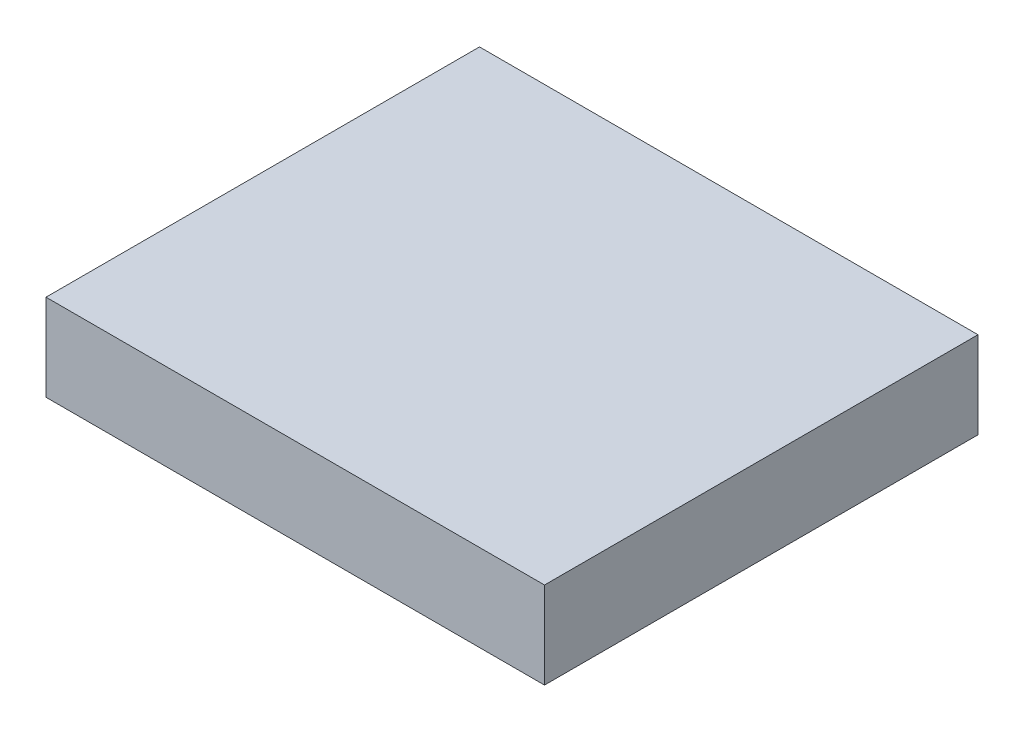
ISO-10303-21;
HEADER;
FILE_DESCRIPTION(('STEP AP214'),'2;1');
FILE_NAME('part.step','',(''),(''),'','','');
FILE_SCHEMA(('AUTOMOTIVE_DESIGN { 1 0 10303 214 1 1 1 1 }'));
ENDSEC;
DATA;
#1=APPLICATION_CONTEXT('core data for automotive mechanical design processes');
#2=APPLICATION_PROTOCOL_DEFINITION('international standard','automotive_design',2000,#1);
#3=PRODUCT_CONTEXT('',#1,'mechanical');
#4=PRODUCT('Part','Part','',(#3));
#5=PRODUCT_RELATED_PRODUCT_CATEGORY('part','',(#4));
#6=PRODUCT_DEFINITION_FORMATION('','',#4);
#7=PRODUCT_DEFINITION_CONTEXT('part definition',#1,'design');
#8=PRODUCT_DEFINITION('design','',#6,#7);
#9=PRODUCT_DEFINITION_SHAPE('','',#8);
#10=(LENGTH_UNIT() NAMED_UNIT(*) SI_UNIT(.MILLI.,.METRE.));
#11=(NAMED_UNIT(*) PLANE_ANGLE_UNIT() SI_UNIT($,.RADIAN.));
#12=(NAMED_UNIT(*) SI_UNIT($,.STERADIAN.) SOLID_ANGLE_UNIT());
#13=UNCERTAINTY_MEASURE_WITH_UNIT(LENGTH_MEASURE(1.E-05),#10,'distance_accuracy_value','');
#14=(GEOMETRIC_REPRESENTATION_CONTEXT(3) GLOBAL_UNCERTAINTY_ASSIGNED_CONTEXT((#13)) GLOBAL_UNIT_ASSIGNED_CONTEXT((#10,
#11,#12)) REPRESENTATION_CONTEXT('',''));
#15=CARTESIAN_POINT('',(0.,0.,0.));
#16=DIRECTION('',(0.,0.,1.));
#17=DIRECTION('',(1.,0.,0.));
#18=AXIS2_PLACEMENT_3D('',#15,#16,#17);
#19=CARTESIAN_POINT('',(-62.6311425092518,20.,-62.9617862825999));
#20=DIRECTION('',(1.,0.,0.));
#21=DIRECTION('',(0.,0.,-1.));
#22=AXIS2_PLACEMENT_3D('',#19,#20,#21);
#23=PLANE('',#22);
#24=DIRECTION('',(0.,0.,1.));
#25=VECTOR('',#24,1.);
#26=CARTESIAN_POINT('',(-62.6311425092518,0.,-62.9617862825999));
#27=LINE('',#26,#25);
#28=CARTESIAN_POINT('',(-62.6311425092518,0.,-62.9617862825999));
#29=VERTEX_POINT('',#28);
#30=CARTESIAN_POINT('',(-62.6311425092518,0.,37.0382137174002));
#31=VERTEX_POINT('',#30);
#32=EDGE_CURVE('E100',#29,#31,#27,.T.);
#33=ORIENTED_EDGE('',*,*,#32,.T.);
#34=DIRECTION('',(0.,-1.,0.));
#35=VECTOR('',#34,1.);
#36=CARTESIAN_POINT('',(-62.6311425092518,20.,37.0382137174002));
#37=LINE('',#36,#35);
#38=CARTESIAN_POINT('',(-62.6311425092518,20.,37.0382137174002));
#39=VERTEX_POINT('',#38);
#40=EDGE_CURVE('E11',#39,#31,#37,.T.);
#41=ORIENTED_EDGE('',*,*,#40,.F.);
#42=DIRECTION('',(0.,0.,1.));
#43=VECTOR('',#42,1.);
#44=CARTESIAN_POINT('',(-62.6311425092518,20.,-62.9617862825999));
#45=LINE('',#44,#43);
#46=CARTESIAN_POINT('',(-62.6311425092518,20.,-62.9617862825999));
#47=VERTEX_POINT('',#46);
#48=EDGE_CURVE('E88',#47,#39,#45,.T.);
#49=ORIENTED_EDGE('',*,*,#48,.F.);
#50=DIRECTION('',(0.,-1.,0.));
#51=VECTOR('',#50,1.);
#52=CARTESIAN_POINT('',(-62.6311425092518,20.,-62.9617862825999));
#53=LINE('',#52,#51);
#54=EDGE_CURVE('E96',#47,#29,#53,.T.);
#55=ORIENTED_EDGE('',*,*,#54,.T.);
#56=EDGE_LOOP('',(#33,#41,#49,#55));
#57=FACE_BOUND('',#56,.T.);
#58=ADVANCED_FACE('F37',(#57),#23,.F.);
#59=CARTESIAN_POINT('',(-62.6311425092518,20.,37.0382137174002));
#60=DIRECTION('',(0.,0.,-1.));
#61=DIRECTION('',(-1.,0.,0.));
#62=AXIS2_PLACEMENT_3D('',#59,#60,#61);
#63=PLANE('',#62);
#64=DIRECTION('',(1.,0.,0.));
#65=VECTOR('',#64,1.);
#66=CARTESIAN_POINT('',(-62.6311425092518,0.,37.0382137174002));
#67=LINE('',#66,#65);
#68=CARTESIAN_POINT('',(52.3688574907482,0.,37.0382137174002));
#69=VERTEX_POINT('',#68);
#70=EDGE_CURVE('E92',#31,#69,#67,.T.);
#71=ORIENTED_EDGE('',*,*,#70,.T.);
#72=DIRECTION('',(0.,-1.,0.));
#73=VECTOR('',#72,1.);
#74=CARTESIAN_POINT('',(52.3688574907482,20.,37.0382137174002));
#75=LINE('',#74,#73);
#76=CARTESIAN_POINT('',(52.3688574907482,20.,37.0382137174002));
#77=VERTEX_POINT('',#76);
#78=EDGE_CURVE('E45',#77,#69,#75,.T.);
#79=ORIENTED_EDGE('',*,*,#78,.F.);
#80=DIRECTION('',(1.,0.,0.));
#81=VECTOR('',#80,1.);
#82=CARTESIAN_POINT('',(-62.6311425092518,20.,37.0382137174002));
#83=LINE('',#82,#81);
#84=EDGE_CURVE('E83',#39,#77,#83,.T.);
#85=ORIENTED_EDGE('',*,*,#84,.F.);
#86=ORIENTED_EDGE('',*,*,#40,.T.);
#87=EDGE_LOOP('',(#71,#79,#85,#86));
#88=FACE_BOUND('',#87,.T.);
#89=ADVANCED_FACE('F91',(#88),#63,.F.);
#90=CARTESIAN_POINT('',(52.3688574907482,20.,-62.9617862825999));
#91=DIRECTION('',(-1.,0.,0.));
#92=DIRECTION('',(0.,0.,1.));
#93=AXIS2_PLACEMENT_3D('',#90,#91,#92);
#94=PLANE('',#93);
#95=DIRECTION('',(0.,0.,-1.));
#96=VECTOR('',#95,1.);
#97=CARTESIAN_POINT('',(52.3688574907482,0.,-62.9617862825999));
#98=LINE('',#97,#96);
#99=CARTESIAN_POINT('',(52.3688574907482,0.,-62.9617862825999));
#100=VERTEX_POINT('',#99);
#101=EDGE_CURVE('E70',#69,#100,#98,.T.);
#102=ORIENTED_EDGE('',*,*,#101,.T.);
#103=DIRECTION('',(0.,-1.,0.));
#104=VECTOR('',#103,1.);
#105=CARTESIAN_POINT('',(52.3688574907482,20.,-62.9617862825999));
#106=LINE('',#105,#104);
#107=CARTESIAN_POINT('',(52.3688574907482,20.,-62.9617862825999));
#108=VERTEX_POINT('',#107);
#109=EDGE_CURVE('E93',#108,#100,#106,.T.);
#110=ORIENTED_EDGE('',*,*,#109,.F.);
#111=DIRECTION('',(0.,0.,-1.));
#112=VECTOR('',#111,1.);
#113=CARTESIAN_POINT('',(52.3688574907482,20.,-62.9617862825999));
#114=LINE('',#113,#112);
#115=EDGE_CURVE('E86',#77,#108,#114,.T.);
#116=ORIENTED_EDGE('',*,*,#115,.F.);
#117=ORIENTED_EDGE('',*,*,#78,.T.);
#118=EDGE_LOOP('',(#102,#110,#116,#117));
#119=FACE_BOUND('',#118,.T.);
#120=ADVANCED_FACE('F94',(#119),#94,.F.);
#121=CARTESIAN_POINT('',(-62.6311425092518,20.,-62.9617862825999));
#122=DIRECTION('',(0.,0.,1.));
#123=DIRECTION('',(1.,0.,0.));
#124=AXIS2_PLACEMENT_3D('',#121,#122,#123);
#125=PLANE('',#124);
#126=DIRECTION('',(-1.,0.,0.));
#127=VECTOR('',#126,1.);
#128=CARTESIAN_POINT('',(-62.6311425092518,0.,-62.9617862825999));
#129=LINE('',#128,#127);
#130=EDGE_CURVE('E76',#100,#29,#129,.T.);
#131=ORIENTED_EDGE('',*,*,#130,.T.);
#132=ORIENTED_EDGE('',*,*,#54,.F.);
#133=DIRECTION('',(-1.,0.,0.));
#134=VECTOR('',#133,1.);
#135=CARTESIAN_POINT('',(-62.6311425092518,20.,-62.9617862825999));
#136=LINE('',#135,#134);
#137=EDGE_CURVE('E53',#108,#47,#136,.T.);
#138=ORIENTED_EDGE('',*,*,#137,.F.);
#139=ORIENTED_EDGE('',*,*,#109,.T.);
#140=EDGE_LOOP('',(#131,#132,#138,#139));
#141=FACE_BOUND('',#140,.T.);
#142=ADVANCED_FACE('F107',(#141),#125,.F.);
#143=CARTESIAN_POINT('',(0.,20.,0.));
#144=DIRECTION('',(0.,1.,0.));
#145=DIRECTION('',(0.,0.,1.));
#146=AXIS2_PLACEMENT_3D('',#143,#144,#145);
#147=PLANE('',#146);
#148=ORIENTED_EDGE('',*,*,#48,.T.);
#149=ORIENTED_EDGE('',*,*,#84,.T.);
#150=ORIENTED_EDGE('',*,*,#115,.T.);
#151=ORIENTED_EDGE('',*,*,#137,.T.);
#152=EDGE_LOOP('',(#148,#149,#150,#151));
#153=FACE_BOUND('',#152,.T.);
#154=ADVANCED_FACE('F84',(#153),#147,.T.);
#155=CARTESIAN_POINT('',(0.,0.,0.));
#156=DIRECTION('',(0.,1.,0.));
#157=DIRECTION('',(0.,0.,1.));
#158=AXIS2_PLACEMENT_3D('',#155,#156,#157);
#159=PLANE('',#158);
#160=ORIENTED_EDGE('',*,*,#32,.F.);
#161=ORIENTED_EDGE('',*,*,#130,.F.);
#162=ORIENTED_EDGE('',*,*,#101,.F.);
#163=ORIENTED_EDGE('',*,*,#70,.F.);
#164=EDGE_LOOP('',(#160,#161,#162,#163));
#165=FACE_BOUND('',#164,.T.);
#166=ADVANCED_FACE('F110',(#165),#159,.F.);
#167=CLOSED_SHELL('',(#58,#89,#120,#142,#154,#166));
#168=MANIFOLD_SOLID_BREP('B2',#167);
#169=ADVANCED_BREP_SHAPE_REPRESENTATION('',(#18,#168),#14);
#170=SHAPE_DEFINITION_REPRESENTATION(#9,#169);
ENDSEC;
END-ISO-10303-21;
